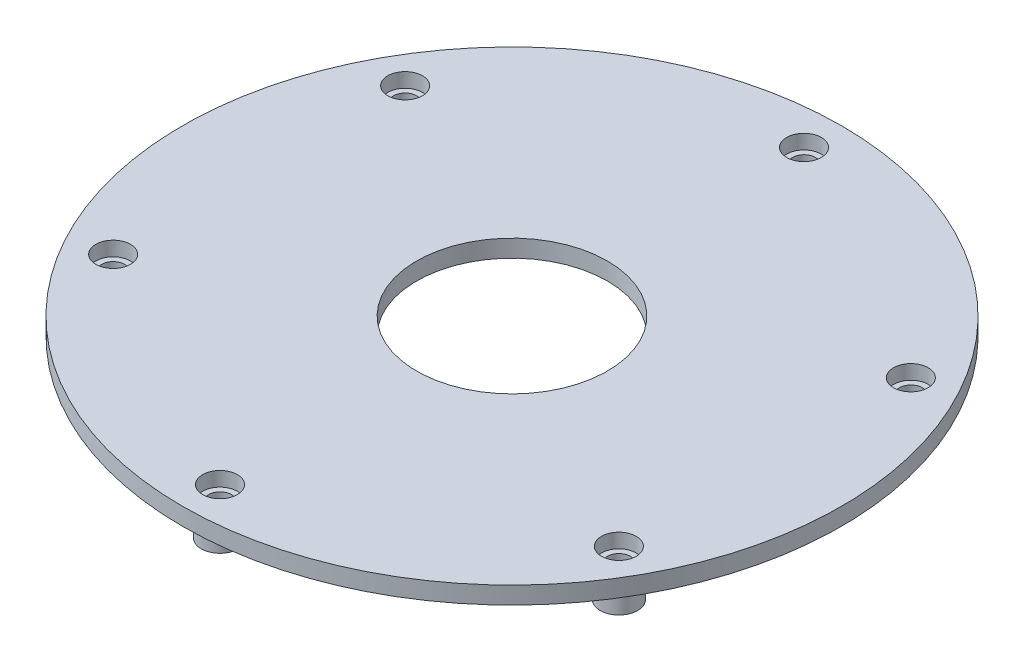
ISO-10303-21;
HEADER;
FILE_DESCRIPTION(('STEP AP214'),'2;1');
FILE_NAME('part.step','',(''),(''),'','','');
FILE_SCHEMA(('AUTOMOTIVE_DESIGN { 1 0 10303 214 1 1 1 1 }'));
ENDSEC;
DATA;
#1=APPLICATION_CONTEXT('core data for automotive mechanical design processes');
#2=APPLICATION_PROTOCOL_DEFINITION('international standard','automotive_design',2000,#1);
#3=PRODUCT_CONTEXT('',#1,'mechanical');
#4=PRODUCT('Part','Part','',(#3));
#5=PRODUCT_RELATED_PRODUCT_CATEGORY('part','',(#4));
#6=PRODUCT_DEFINITION_FORMATION('','',#4);
#7=PRODUCT_DEFINITION_CONTEXT('part definition',#1,'design');
#8=PRODUCT_DEFINITION('design','',#6,#7);
#9=PRODUCT_DEFINITION_SHAPE('','',#8);
#10=(LENGTH_UNIT() NAMED_UNIT(*) SI_UNIT(.MILLI.,.METRE.));
#11=(NAMED_UNIT(*) PLANE_ANGLE_UNIT() SI_UNIT($,.RADIAN.));
#12=(NAMED_UNIT(*) SI_UNIT($,.STERADIAN.) SOLID_ANGLE_UNIT());
#13=UNCERTAINTY_MEASURE_WITH_UNIT(LENGTH_MEASURE(1.E-05),#10,'distance_accuracy_value','');
#14=(GEOMETRIC_REPRESENTATION_CONTEXT(3) GLOBAL_UNCERTAINTY_ASSIGNED_CONTEXT((#13)) GLOBAL_UNIT_ASSIGNED_CONTEXT((#10,
#11,#12)) REPRESENTATION_CONTEXT('',''));
#15=CARTESIAN_POINT('',(0.,0.,0.));
#16=DIRECTION('',(0.,0.,1.));
#17=DIRECTION('',(1.,0.,0.));
#18=AXIS2_PLACEMENT_3D('',#15,#16,#17);
#19=CARTESIAN_POINT('',(0.,0.,-50.5));
#20=DIRECTION('',(0.,1.,0.));
#21=DIRECTION('',(0.,0.,1.));
#22=AXIS2_PLACEMENT_3D('',#19,#20,#21);
#23=CYLINDRICAL_SURFACE('',#22,2.);
#24=CARTESIAN_POINT('',(0.,-5.,-50.5));
#25=DIRECTION('',(0.,1.,0.));
#26=DIRECTION('',(0.,0.,1.));
#27=AXIS2_PLACEMENT_3D('',#24,#25,#26);
#28=CIRCLE('',#27,2.);
#29=CARTESIAN_POINT('',(0.,-5.,-48.5));
#30=VERTEX_POINT('',#29);
#31=EDGE_CURVE('E84',#30,#30,#28,.T.);
#32=ORIENTED_EDGE('',*,*,#31,.F.);
#33=EDGE_LOOP('',(#32));
#34=FACE_BOUND('',#33,.T.);
#35=CARTESIAN_POINT('',(0.,0.5,-50.5));
#36=DIRECTION('',(0.,1.,0.));
#37=DIRECTION('',(0.,0.,1.));
#38=AXIS2_PLACEMENT_3D('',#35,#36,#37);
#39=CIRCLE('',#38,2.);
#40=CARTESIAN_POINT('',(0.,0.5,-48.5));
#41=VERTEX_POINT('',#40);
#42=EDGE_CURVE('E41',#41,#41,#39,.F.);
#43=ORIENTED_EDGE('',*,*,#42,.F.);
#44=EDGE_LOOP('',(#43));
#45=FACE_BOUND('',#44,.T.);
#46=ADVANCED_FACE('F37',(#34,#45),#23,.F.);
#47=CARTESIAN_POINT('',(-43.7342828911142,0.,-25.2499999999999));
#48=DIRECTION('',(0.,1.,0.));
#49=DIRECTION('',(0.,0.,1.));
#50=AXIS2_PLACEMENT_3D('',#47,#48,#49);
#51=CYLINDRICAL_SURFACE('',#50,2.);
#52=CARTESIAN_POINT('',(-43.7342828911142,-5.,-25.2499999999999));
#53=DIRECTION('',(0.,1.,0.));
#54=DIRECTION('',(0.,0.,1.));
#55=AXIS2_PLACEMENT_3D('',#52,#53,#54);
#56=CIRCLE('',#55,2.);
#57=CARTESIAN_POINT('',(-43.7342828911142,-5.,-23.2499999999999));
#58=VERTEX_POINT('',#57);
#59=EDGE_CURVE('E79',#58,#58,#56,.T.);
#60=ORIENTED_EDGE('',*,*,#59,.F.);
#61=EDGE_LOOP('',(#60));
#62=FACE_BOUND('',#61,.T.);
#63=CARTESIAN_POINT('',(-43.7342828911142,0.5,-25.2499999999999));
#64=DIRECTION('',(0.,1.,0.));
#65=DIRECTION('',(0.,0.,1.));
#66=AXIS2_PLACEMENT_3D('',#63,#64,#65);
#67=CIRCLE('',#66,2.);
#68=CARTESIAN_POINT('',(-43.7342828911142,0.5,-23.2499999999999));
#69=VERTEX_POINT('',#68);
#70=EDGE_CURVE('E72',#69,#69,#67,.F.);
#71=ORIENTED_EDGE('',*,*,#70,.F.);
#72=EDGE_LOOP('',(#71));
#73=FACE_BOUND('',#72,.T.);
#74=ADVANCED_FACE('F184',(#62,#73),#51,.F.);
#75=CARTESIAN_POINT('',(-43.734282891114,0.,25.2500000000002));
#76=DIRECTION('',(0.,1.,0.));
#77=DIRECTION('',(0.,0.,1.));
#78=AXIS2_PLACEMENT_3D('',#75,#76,#77);
#79=CYLINDRICAL_SURFACE('',#78,2.);
#80=CARTESIAN_POINT('',(-43.734282891114,-5.,25.2500000000002));
#81=DIRECTION('',(0.,1.,0.));
#82=DIRECTION('',(0.,0.,1.));
#83=AXIS2_PLACEMENT_3D('',#80,#81,#82);
#84=CIRCLE('',#83,2.);
#85=CARTESIAN_POINT('',(-43.734282891114,-5.,27.2500000000002));
#86=VERTEX_POINT('',#85);
#87=EDGE_CURVE('E94',#86,#86,#84,.T.);
#88=ORIENTED_EDGE('',*,*,#87,.F.);
#89=EDGE_LOOP('',(#88));
#90=FACE_BOUND('',#89,.T.);
#91=CARTESIAN_POINT('',(-43.734282891114,0.5,25.2500000000002));
#92=DIRECTION('',(0.,1.,0.));
#93=DIRECTION('',(0.,0.,1.));
#94=AXIS2_PLACEMENT_3D('',#91,#92,#93);
#95=CIRCLE('',#94,2.);
#96=CARTESIAN_POINT('',(-43.734282891114,0.5,27.2500000000002));
#97=VERTEX_POINT('',#96);
#98=EDGE_CURVE('E69',#97,#97,#95,.F.);
#99=ORIENTED_EDGE('',*,*,#98,.F.);
#100=EDGE_LOOP('',(#99));
#101=FACE_BOUND('',#100,.T.);
#102=ADVANCED_FACE('F190',(#90,#101),#79,.F.);
#103=CARTESIAN_POINT('',(0.,0.,50.5));
#104=DIRECTION('',(0.,1.,0.));
#105=DIRECTION('',(0.,0.,1.));
#106=AXIS2_PLACEMENT_3D('',#103,#104,#105);
#107=CYLINDRICAL_SURFACE('',#106,2.);
#108=CARTESIAN_POINT('',(0.,-5.,50.5));
#109=DIRECTION('',(0.,1.,0.));
#110=DIRECTION('',(0.,0.,1.));
#111=AXIS2_PLACEMENT_3D('',#108,#109,#110);
#112=CIRCLE('',#111,2.);
#113=CARTESIAN_POINT('',(0.,-5.,52.5));
#114=VERTEX_POINT('',#113);
#115=EDGE_CURVE('E99',#114,#114,#112,.T.);
#116=ORIENTED_EDGE('',*,*,#115,.F.);
#117=EDGE_LOOP('',(#116));
#118=FACE_BOUND('',#117,.T.);
#119=CARTESIAN_POINT('',(0.,0.5,50.5));
#120=DIRECTION('',(0.,1.,0.));
#121=DIRECTION('',(0.,0.,1.));
#122=AXIS2_PLACEMENT_3D('',#119,#120,#121);
#123=CIRCLE('',#122,2.);
#124=CARTESIAN_POINT('',(0.,0.5,52.5));
#125=VERTEX_POINT('',#124);
#126=EDGE_CURVE('E65',#125,#125,#123,.F.);
#127=ORIENTED_EDGE('',*,*,#126,.F.);
#128=EDGE_LOOP('',(#127));
#129=FACE_BOUND('',#128,.T.);
#130=ADVANCED_FACE('F198',(#118,#129),#107,.F.);
#131=CARTESIAN_POINT('',(43.7342828911144,0.,25.2499999999996));
#132=DIRECTION('',(0.,1.,0.));
#133=DIRECTION('',(0.,0.,1.));
#134=AXIS2_PLACEMENT_3D('',#131,#132,#133);
#135=CYLINDRICAL_SURFACE('',#134,2.);
#136=CARTESIAN_POINT('',(43.7342828911144,-5.,25.2499999999996));
#137=DIRECTION('',(0.,1.,0.));
#138=DIRECTION('',(0.,0.,1.));
#139=AXIS2_PLACEMENT_3D('',#136,#137,#138);
#140=CIRCLE('',#139,2.);
#141=CARTESIAN_POINT('',(43.7342828911144,-5.,27.2499999999996));
#142=VERTEX_POINT('',#141);
#143=EDGE_CURVE('E356',#142,#142,#140,.T.);
#144=ORIENTED_EDGE('',*,*,#143,.F.);
#145=EDGE_LOOP('',(#144));
#146=FACE_BOUND('',#145,.T.);
#147=CARTESIAN_POINT('',(43.7342828911144,0.5,25.2499999999996));
#148=DIRECTION('',(0.,1.,0.));
#149=DIRECTION('',(0.,0.,1.));
#150=AXIS2_PLACEMENT_3D('',#147,#148,#149);
#151=CIRCLE('',#150,2.);
#152=CARTESIAN_POINT('',(43.7342828911144,0.5,27.2499999999996));
#153=VERTEX_POINT('',#152);
#154=EDGE_CURVE('E60',#153,#153,#151,.F.);
#155=ORIENTED_EDGE('',*,*,#154,.F.);
#156=EDGE_LOOP('',(#155));
#157=FACE_BOUND('',#156,.T.);
#158=ADVANCED_FACE('F179',(#146,#157),#135,.F.);
#159=CARTESIAN_POINT('',(43.7342828911139,0.,-25.2500000000005));
#160=DIRECTION('',(0.,1.,0.));
#161=DIRECTION('',(0.,0.,1.));
#162=AXIS2_PLACEMENT_3D('',#159,#160,#161);
#163=CYLINDRICAL_SURFACE('',#162,2.);
#164=CARTESIAN_POINT('',(43.7342828911139,-5.,-25.2500000000005));
#165=DIRECTION('',(0.,1.,0.));
#166=DIRECTION('',(0.,0.,1.));
#167=AXIS2_PLACEMENT_3D('',#164,#165,#166);
#168=CIRCLE('',#167,2.);
#169=CARTESIAN_POINT('',(43.7342828911139,-5.,-23.2500000000005));
#170=VERTEX_POINT('',#169);
#171=EDGE_CURVE('E90',#170,#170,#168,.T.);
#172=ORIENTED_EDGE('',*,*,#171,.F.);
#173=EDGE_LOOP('',(#172));
#174=FACE_BOUND('',#173,.T.);
#175=CARTESIAN_POINT('',(43.7342828911139,0.5,-25.2500000000005));
#176=DIRECTION('',(0.,1.,0.));
#177=DIRECTION('',(0.,0.,1.));
#178=AXIS2_PLACEMENT_3D('',#175,#176,#177);
#179=CIRCLE('',#178,2.);
#180=CARTESIAN_POINT('',(43.7342828911139,0.5,-23.2500000000005));
#181=VERTEX_POINT('',#180);
#182=EDGE_CURVE('E56',#181,#181,#179,.F.);
#183=ORIENTED_EDGE('',*,*,#182,.F.);
#184=EDGE_LOOP('',(#183));
#185=FACE_BOUND('',#184,.T.);
#186=ADVANCED_FACE('F171',(#174,#185),#163,.F.);
#187=CARTESIAN_POINT('',(0.,3.,0.));
#188=DIRECTION('',(0.,-1.,0.));
#189=DIRECTION('',(0.,0.,-1.));
#190=AXIS2_PLACEMENT_3D('',#187,#188,#189);
#191=CYLINDRICAL_SURFACE('',#190,57.);
#192=CARTESIAN_POINT('',(0.,3.,0.));
#193=DIRECTION('',(0.,1.,0.));
#194=DIRECTION('',(0.,0.,1.));
#195=AXIS2_PLACEMENT_3D('',#192,#193,#194);
#196=CIRCLE('',#195,57.);
#197=CARTESIAN_POINT('',(0.,3.,57.));
#198=VERTEX_POINT('',#197);
#199=EDGE_CURVE('E132',#198,#198,#196,.T.);
#200=ORIENTED_EDGE('',*,*,#199,.F.);
#201=EDGE_LOOP('',(#200));
#202=FACE_BOUND('',#201,.T.);
#203=CARTESIAN_POINT('',(0.,0.,0.));
#204=DIRECTION('',(0.,1.,0.));
#205=DIRECTION('',(0.,0.,1.));
#206=AXIS2_PLACEMENT_3D('',#203,#204,#205);
#207=CIRCLE('',#206,57.);
#208=CARTESIAN_POINT('',(0.,0.,57.));
#209=VERTEX_POINT('',#208);
#210=EDGE_CURVE('E131',#209,#209,#207,.T.);
#211=ORIENTED_EDGE('',*,*,#210,.T.);
#212=EDGE_LOOP('',(#211));
#213=FACE_BOUND('',#212,.T.);
#214=ADVANCED_FACE('F39',(#202,#213),#191,.T.);
#215=CARTESIAN_POINT('',(0.,3.,0.));
#216=DIRECTION('',(0.,1.,0.));
#217=DIRECTION('',(0.,0.,1.));
#218=AXIS2_PLACEMENT_3D('',#215,#216,#217);
#219=PLANE('',#218);
#220=CARTESIAN_POINT('',(-43.734282891114,3.,25.2500000000002));
#221=DIRECTION('',(0.,1.,0.));
#222=DIRECTION('',(0.,0.,1.));
#223=AXIS2_PLACEMENT_3D('',#220,#221,#222);
#224=CIRCLE('',#223,3.);
#225=CARTESIAN_POINT('',(-43.734282891114,3.,28.2500000000002));
#226=VERTEX_POINT('',#225);
#227=EDGE_CURVE('E346',#226,#226,#224,.T.);
#228=ORIENTED_EDGE('',*,*,#227,.F.);
#229=EDGE_LOOP('',(#228));
#230=FACE_BOUND('',#229,.T.);
#231=CARTESIAN_POINT('',(0.,3.,50.5));
#232=DIRECTION('',(0.,1.,0.));
#233=DIRECTION('',(0.,0.,1.));
#234=AXIS2_PLACEMENT_3D('',#231,#232,#233);
#235=CIRCLE('',#234,3.);
#236=CARTESIAN_POINT('',(0.,3.,53.5));
#237=VERTEX_POINT('',#236);
#238=EDGE_CURVE('E338',#237,#237,#235,.T.);
#239=ORIENTED_EDGE('',*,*,#238,.F.);
#240=EDGE_LOOP('',(#239));
#241=FACE_BOUND('',#240,.T.);
#242=CARTESIAN_POINT('',(43.7342828911144,3.,25.2499999999996));
#243=DIRECTION('',(0.,1.,0.));
#244=DIRECTION('',(0.,0.,1.));
#245=AXIS2_PLACEMENT_3D('',#242,#243,#244);
#246=CIRCLE('',#245,3.);
#247=CARTESIAN_POINT('',(43.7342828911144,3.,28.2499999999996));
#248=VERTEX_POINT('',#247);
#249=EDGE_CURVE('E330',#248,#248,#246,.T.);
#250=ORIENTED_EDGE('',*,*,#249,.F.);
#251=EDGE_LOOP('',(#250));
#252=FACE_BOUND('',#251,.T.);
#253=CARTESIAN_POINT('',(43.7342828911139,3.,-25.2500000000005));
#254=DIRECTION('',(0.,1.,0.));
#255=DIRECTION('',(0.,0.,1.));
#256=AXIS2_PLACEMENT_3D('',#253,#254,#255);
#257=CIRCLE('',#256,3.);
#258=CARTESIAN_POINT('',(43.7342828911139,3.,-22.2500000000005));
#259=VERTEX_POINT('',#258);
#260=EDGE_CURVE('E322',#259,#259,#257,.T.);
#261=ORIENTED_EDGE('',*,*,#260,.F.);
#262=EDGE_LOOP('',(#261));
#263=FACE_BOUND('',#262,.T.);
#264=CARTESIAN_POINT('',(0.,3.,-50.5));
#265=DIRECTION('',(0.,1.,0.));
#266=DIRECTION('',(0.,0.,1.));
#267=AXIS2_PLACEMENT_3D('',#264,#265,#266);
#268=CIRCLE('',#267,3.);
#269=CARTESIAN_POINT('',(0.,3.,-47.5));
#270=VERTEX_POINT('',#269);
#271=EDGE_CURVE('E309',#270,#270,#268,.T.);
#272=ORIENTED_EDGE('',*,*,#271,.F.);
#273=EDGE_LOOP('',(#272));
#274=FACE_BOUND('',#273,.T.);
#275=CARTESIAN_POINT('',(-43.7342828911142,3.,-25.2499999999999));
#276=DIRECTION('',(0.,1.,0.));
#277=DIRECTION('',(0.,0.,1.));
#278=AXIS2_PLACEMENT_3D('',#275,#276,#277);
#279=CIRCLE('',#278,3.);
#280=CARTESIAN_POINT('',(-43.7342828911142,3.,-22.2499999999999));
#281=VERTEX_POINT('',#280);
#282=EDGE_CURVE('E308',#281,#281,#279,.T.);
#283=ORIENTED_EDGE('',*,*,#282,.F.);
#284=EDGE_LOOP('',(#283));
#285=FACE_BOUND('',#284,.T.);
#286=CARTESIAN_POINT('',(0.,3.,0.));
#287=DIRECTION('',(0.,-1.,0.));
#288=DIRECTION('',(0.,0.,-1.));
#289=AXIS2_PLACEMENT_3D('',#286,#287,#288);
#290=CIRCLE('',#289,16.5);
#291=CARTESIAN_POINT('',(0.,3.,-16.5));
#292=VERTEX_POINT('',#291);
#293=EDGE_CURVE('E100',#292,#292,#290,.T.);
#294=ORIENTED_EDGE('',*,*,#293,.T.);
#295=EDGE_LOOP('',(#294));
#296=FACE_BOUND('',#295,.T.);
#297=ORIENTED_EDGE('',*,*,#199,.T.);
#298=EDGE_LOOP('',(#297));
#299=FACE_BOUND('',#298,.T.);
#300=ADVANCED_FACE('F160',(#230,#241,#252,#263,#274,#285,#296,#299),#219,.T.);
#301=CARTESIAN_POINT('',(0.,0.,0.));
#302=DIRECTION('',(0.,1.,0.));
#303=DIRECTION('',(0.,0.,1.));
#304=AXIS2_PLACEMENT_3D('',#301,#302,#303);
#305=PLANE('',#304);
#306=CARTESIAN_POINT('',(0.,0.,0.));
#307=DIRECTION('',(0.,-1.,0.));
#308=DIRECTION('',(0.,0.,-1.));
#309=AXIS2_PLACEMENT_3D('',#306,#307,#308);
#310=CIRCLE('',#309,16.5);
#311=CARTESIAN_POINT('',(0.,0.,-16.5));
#312=VERTEX_POINT('',#311);
#313=EDGE_CURVE('E98',#312,#312,#310,.T.);
#314=ORIENTED_EDGE('',*,*,#313,.F.);
#315=EDGE_LOOP('',(#314));
#316=FACE_BOUND('',#315,.T.);
#317=CARTESIAN_POINT('',(-43.734282891114,0.,25.2500000000002));
#318=DIRECTION('',(0.,1.,0.));
#319=DIRECTION('',(0.,0.,1.));
#320=AXIS2_PLACEMENT_3D('',#317,#318,#319);
#321=CIRCLE('',#320,3.25);
#322=CARTESIAN_POINT('',(-43.734282891114,0.,28.5000000000002));
#323=VERTEX_POINT('',#322);
#324=EDGE_CURVE('E10',#323,#323,#321,.F.);
#325=ORIENTED_EDGE('',*,*,#324,.F.);
#326=EDGE_LOOP('',(#325));
#327=FACE_BOUND('',#326,.T.);
#328=CARTESIAN_POINT('',(-43.7342828911142,0.,-25.2499999999999));
#329=DIRECTION('',(0.,1.,0.));
#330=DIRECTION('',(0.,0.,1.));
#331=AXIS2_PLACEMENT_3D('',#328,#329,#330);
#332=CIRCLE('',#331,3.25);
#333=CARTESIAN_POINT('',(-43.7342828911142,0.,-21.9999999999999));
#334=VERTEX_POINT('',#333);
#335=EDGE_CURVE('E46',#334,#334,#332,.F.);
#336=ORIENTED_EDGE('',*,*,#335,.F.);
#337=EDGE_LOOP('',(#336));
#338=FACE_BOUND('',#337,.T.);
#339=CARTESIAN_POINT('',(0.,0.,-50.5));
#340=DIRECTION('',(0.,1.,0.));
#341=DIRECTION('',(0.,0.,1.));
#342=AXIS2_PLACEMENT_3D('',#339,#340,#341);
#343=CIRCLE('',#342,3.25);
#344=CARTESIAN_POINT('',(0.,0.,-47.25));
#345=VERTEX_POINT('',#344);
#346=EDGE_CURVE('E52',#345,#345,#343,.F.);
#347=ORIENTED_EDGE('',*,*,#346,.F.);
#348=EDGE_LOOP('',(#347));
#349=FACE_BOUND('',#348,.T.);
#350=CARTESIAN_POINT('',(43.7342828911139,0.,-25.2500000000005));
#351=DIRECTION('',(0.,1.,0.));
#352=DIRECTION('',(0.,0.,1.));
#353=AXIS2_PLACEMENT_3D('',#350,#351,#352);
#354=CIRCLE('',#353,3.25);
#355=CARTESIAN_POINT('',(43.7342828911139,0.,-22.0000000000005));
#356=VERTEX_POINT('',#355);
#357=EDGE_CURVE('E147',#356,#356,#354,.F.);
#358=ORIENTED_EDGE('',*,*,#357,.F.);
#359=EDGE_LOOP('',(#358));
#360=FACE_BOUND('',#359,.T.);
#361=CARTESIAN_POINT('',(43.7342828911144,0.,25.2499999999996));
#362=DIRECTION('',(0.,1.,0.));
#363=DIRECTION('',(0.,0.,1.));
#364=AXIS2_PLACEMENT_3D('',#361,#362,#363);
#365=CIRCLE('',#364,3.25);
#366=CARTESIAN_POINT('',(43.7342828911144,0.,28.4999999999996));
#367=VERTEX_POINT('',#366);
#368=EDGE_CURVE('E143',#367,#367,#365,.F.);
#369=ORIENTED_EDGE('',*,*,#368,.F.);
#370=EDGE_LOOP('',(#369));
#371=FACE_BOUND('',#370,.T.);
#372=CARTESIAN_POINT('',(0.,0.,50.5));
#373=DIRECTION('',(0.,1.,0.));
#374=DIRECTION('',(0.,0.,1.));
#375=AXIS2_PLACEMENT_3D('',#372,#373,#374);
#376=CIRCLE('',#375,3.25);
#377=CARTESIAN_POINT('',(0.,0.,53.75));
#378=VERTEX_POINT('',#377);
#379=EDGE_CURVE('E136',#378,#378,#376,.F.);
#380=ORIENTED_EDGE('',*,*,#379,.F.);
#381=EDGE_LOOP('',(#380));
#382=FACE_BOUND('',#381,.T.);
#383=ORIENTED_EDGE('',*,*,#210,.F.);
#384=EDGE_LOOP('',(#383));
#385=FACE_BOUND('',#384,.T.);
#386=ADVANCED_FACE('F156',(#316,#327,#338,#349,#360,#371,#382,#385),#305,.F.);
#387=CARTESIAN_POINT('',(0.,-5.,50.5));
#388=DIRECTION('',(0.,1.,0.));
#389=DIRECTION('',(0.,0.,1.));
#390=AXIS2_PLACEMENT_3D('',#387,#388,#389);
#391=CYLINDRICAL_SURFACE('',#390,3.25);
#392=CARTESIAN_POINT('',(0.,-5.,50.5));
#393=DIRECTION('',(0.,-1.,0.));
#394=DIRECTION('',(0.,0.,-1.));
#395=AXIS2_PLACEMENT_3D('',#392,#393,#394);
#396=CIRCLE('',#395,3.25);
#397=CARTESIAN_POINT('',(0.,-5.,47.25));
#398=VERTEX_POINT('',#397);
#399=EDGE_CURVE('E127',#398,#398,#396,.T.);
#400=ORIENTED_EDGE('',*,*,#399,.F.);
#401=EDGE_LOOP('',(#400));
#402=FACE_BOUND('',#401,.T.);
#403=ORIENTED_EDGE('',*,*,#379,.T.);
#404=EDGE_LOOP('',(#403));
#405=FACE_BOUND('',#404,.T.);
#406=ADVANCED_FACE('F159',(#402,#405),#391,.T.);
#407=CARTESIAN_POINT('',(0.,-5.,50.5));
#408=DIRECTION('',(0.,-1.,0.));
#409=DIRECTION('',(0.,0.,-1.));
#410=AXIS2_PLACEMENT_3D('',#407,#408,#409);
#411=PLANE('',#410);
#412=ORIENTED_EDGE('',*,*,#115,.T.);
#413=EDGE_LOOP('',(#412));
#414=FACE_BOUND('',#413,.T.);
#415=ORIENTED_EDGE('',*,*,#399,.T.);
#416=EDGE_LOOP('',(#415));
#417=FACE_BOUND('',#416,.T.);
#418=ADVANCED_FACE('F208',(#414,#417),#411,.T.);
#419=CARTESIAN_POINT('',(43.7342828911144,-5.,25.2499999999996));
#420=DIRECTION('',(0.,1.,0.));
#421=DIRECTION('',(0.,0.,1.));
#422=AXIS2_PLACEMENT_3D('',#419,#420,#421);
#423=CYLINDRICAL_SURFACE('',#422,3.25);
#424=CARTESIAN_POINT('',(43.7342828911144,-5.,25.2499999999996));
#425=DIRECTION('',(0.,-1.,0.));
#426=DIRECTION('',(0.,0.,-1.));
#427=AXIS2_PLACEMENT_3D('',#424,#425,#426);
#428=CIRCLE('',#427,3.25);
#429=CARTESIAN_POINT('',(43.7342828911144,-5.,21.9999999999996));
#430=VERTEX_POINT('',#429);
#431=EDGE_CURVE('E123',#430,#430,#428,.T.);
#432=ORIENTED_EDGE('',*,*,#431,.F.);
#433=EDGE_LOOP('',(#432));
#434=FACE_BOUND('',#433,.T.);
#435=ORIENTED_EDGE('',*,*,#368,.T.);
#436=EDGE_LOOP('',(#435));
#437=FACE_BOUND('',#436,.T.);
#438=ADVANCED_FACE('F212',(#434,#437),#423,.T.);
#439=CARTESIAN_POINT('',(43.7342828911144,-5.,25.2499999999996));
#440=DIRECTION('',(0.,-1.,0.));
#441=DIRECTION('',(0.,0.,-1.));
#442=AXIS2_PLACEMENT_3D('',#439,#440,#441);
#443=PLANE('',#442);
#444=ORIENTED_EDGE('',*,*,#143,.T.);
#445=EDGE_LOOP('',(#444));
#446=FACE_BOUND('',#445,.T.);
#447=ORIENTED_EDGE('',*,*,#431,.T.);
#448=EDGE_LOOP('',(#447));
#449=FACE_BOUND('',#448,.T.);
#450=ADVANCED_FACE('F216',(#446,#449),#443,.T.);
#451=CARTESIAN_POINT('',(43.7342828911139,-5.,-25.2500000000005));
#452=DIRECTION('',(0.,1.,0.));
#453=DIRECTION('',(0.,0.,1.));
#454=AXIS2_PLACEMENT_3D('',#451,#452,#453);
#455=CYLINDRICAL_SURFACE('',#454,3.25);
#456=CARTESIAN_POINT('',(43.7342828911139,-5.,-25.2500000000005));
#457=DIRECTION('',(0.,-1.,0.));
#458=DIRECTION('',(0.,0.,-1.));
#459=AXIS2_PLACEMENT_3D('',#456,#457,#458);
#460=CIRCLE('',#459,3.25);
#461=CARTESIAN_POINT('',(43.7342828911139,-5.,-28.5000000000005));
#462=VERTEX_POINT('',#461);
#463=EDGE_CURVE('E119',#462,#462,#460,.T.);
#464=ORIENTED_EDGE('',*,*,#463,.F.);
#465=EDGE_LOOP('',(#464));
#466=FACE_BOUND('',#465,.T.);
#467=ORIENTED_EDGE('',*,*,#357,.T.);
#468=EDGE_LOOP('',(#467));
#469=FACE_BOUND('',#468,.T.);
#470=ADVANCED_FACE('F220',(#466,#469),#455,.T.);
#471=CARTESIAN_POINT('',(43.7342828911139,-5.,-25.2500000000005));
#472=DIRECTION('',(0.,-1.,0.));
#473=DIRECTION('',(0.,0.,-1.));
#474=AXIS2_PLACEMENT_3D('',#471,#472,#473);
#475=PLANE('',#474);
#476=ORIENTED_EDGE('',*,*,#171,.T.);
#477=EDGE_LOOP('',(#476));
#478=FACE_BOUND('',#477,.T.);
#479=ORIENTED_EDGE('',*,*,#463,.T.);
#480=EDGE_LOOP('',(#479));
#481=FACE_BOUND('',#480,.T.);
#482=ADVANCED_FACE('F224',(#478,#481),#475,.T.);
#483=CARTESIAN_POINT('',(0.,-5.,-50.5));
#484=DIRECTION('',(0.,1.,0.));
#485=DIRECTION('',(0.,0.,1.));
#486=AXIS2_PLACEMENT_3D('',#483,#484,#485);
#487=CYLINDRICAL_SURFACE('',#486,3.25);
#488=CARTESIAN_POINT('',(0.,-5.,-50.5));
#489=DIRECTION('',(0.,-1.,0.));
#490=DIRECTION('',(0.,0.,-1.));
#491=AXIS2_PLACEMENT_3D('',#488,#489,#490);
#492=CIRCLE('',#491,3.25);
#493=CARTESIAN_POINT('',(0.,-5.,-53.75));
#494=VERTEX_POINT('',#493);
#495=EDGE_CURVE('E115',#494,#494,#492,.T.);
#496=ORIENTED_EDGE('',*,*,#495,.F.);
#497=EDGE_LOOP('',(#496));
#498=FACE_BOUND('',#497,.T.);
#499=ORIENTED_EDGE('',*,*,#346,.T.);
#500=EDGE_LOOP('',(#499));
#501=FACE_BOUND('',#500,.T.);
#502=ADVANCED_FACE('F154',(#498,#501),#487,.T.);
#503=CARTESIAN_POINT('',(0.,-5.,-50.5));
#504=DIRECTION('',(0.,-1.,0.));
#505=DIRECTION('',(0.,0.,-1.));
#506=AXIS2_PLACEMENT_3D('',#503,#504,#505);
#507=PLANE('',#506);
#508=ORIENTED_EDGE('',*,*,#31,.T.);
#509=EDGE_LOOP('',(#508));
#510=FACE_BOUND('',#509,.T.);
#511=ORIENTED_EDGE('',*,*,#495,.T.);
#512=EDGE_LOOP('',(#511));
#513=FACE_BOUND('',#512,.T.);
#514=ADVANCED_FACE('F231',(#510,#513),#507,.T.);
#515=CARTESIAN_POINT('',(-43.7342828911142,-5.,-25.2499999999999));
#516=DIRECTION('',(0.,1.,0.));
#517=DIRECTION('',(0.,0.,1.));
#518=AXIS2_PLACEMENT_3D('',#515,#516,#517);
#519=CYLINDRICAL_SURFACE('',#518,3.25);
#520=CARTESIAN_POINT('',(-43.7342828911142,-5.,-25.2499999999999));
#521=DIRECTION('',(0.,-1.,0.));
#522=DIRECTION('',(0.,0.,-1.));
#523=AXIS2_PLACEMENT_3D('',#520,#521,#522);
#524=CIRCLE('',#523,3.25);
#525=CARTESIAN_POINT('',(-43.7342828911142,-5.,-28.4999999999999));
#526=VERTEX_POINT('',#525);
#527=EDGE_CURVE('E111',#526,#526,#524,.T.);
#528=ORIENTED_EDGE('',*,*,#527,.F.);
#529=EDGE_LOOP('',(#528));
#530=FACE_BOUND('',#529,.T.);
#531=ORIENTED_EDGE('',*,*,#335,.T.);
#532=EDGE_LOOP('',(#531));
#533=FACE_BOUND('',#532,.T.);
#534=ADVANCED_FACE('F235',(#530,#533),#519,.T.);
#535=CARTESIAN_POINT('',(-43.7342828911142,-5.,-25.2499999999999));
#536=DIRECTION('',(0.,-1.,0.));
#537=DIRECTION('',(0.,0.,-1.));
#538=AXIS2_PLACEMENT_3D('',#535,#536,#537);
#539=PLANE('',#538);
#540=ORIENTED_EDGE('',*,*,#59,.T.);
#541=EDGE_LOOP('',(#540));
#542=FACE_BOUND('',#541,.T.);
#543=ORIENTED_EDGE('',*,*,#527,.T.);
#544=EDGE_LOOP('',(#543));
#545=FACE_BOUND('',#544,.T.);
#546=ADVANCED_FACE('F239',(#542,#545),#539,.T.);
#547=CARTESIAN_POINT('',(-43.734282891114,-5.,25.2500000000002));
#548=DIRECTION('',(0.,1.,0.));
#549=DIRECTION('',(0.,0.,1.));
#550=AXIS2_PLACEMENT_3D('',#547,#548,#549);
#551=CYLINDRICAL_SURFACE('',#550,3.25);
#552=CARTESIAN_POINT('',(-43.734282891114,-5.,25.2500000000002));
#553=DIRECTION('',(0.,-1.,0.));
#554=DIRECTION('',(0.,0.,-1.));
#555=AXIS2_PLACEMENT_3D('',#552,#553,#554);
#556=CIRCLE('',#555,3.25);
#557=CARTESIAN_POINT('',(-43.734282891114,-5.,22.0000000000002));
#558=VERTEX_POINT('',#557);
#559=EDGE_CURVE('E104',#558,#558,#556,.T.);
#560=ORIENTED_EDGE('',*,*,#559,.F.);
#561=EDGE_LOOP('',(#560));
#562=FACE_BOUND('',#561,.T.);
#563=ORIENTED_EDGE('',*,*,#324,.T.);
#564=EDGE_LOOP('',(#563));
#565=FACE_BOUND('',#564,.T.);
#566=ADVANCED_FACE('F243',(#562,#565),#551,.T.);
#567=CARTESIAN_POINT('',(-43.734282891114,-5.,25.2500000000002));
#568=DIRECTION('',(0.,-1.,0.));
#569=DIRECTION('',(0.,0.,-1.));
#570=AXIS2_PLACEMENT_3D('',#567,#568,#569);
#571=PLANE('',#570);
#572=ORIENTED_EDGE('',*,*,#87,.T.);
#573=EDGE_LOOP('',(#572));
#574=FACE_BOUND('',#573,.T.);
#575=ORIENTED_EDGE('',*,*,#559,.T.);
#576=EDGE_LOOP('',(#575));
#577=FACE_BOUND('',#576,.T.);
#578=ADVANCED_FACE('F246',(#574,#577),#571,.T.);
#579=CARTESIAN_POINT('',(0.,3.,0.));
#580=DIRECTION('',(0.,-1.,0.));
#581=DIRECTION('',(0.,0.,-1.));
#582=AXIS2_PLACEMENT_3D('',#579,#580,#581);
#583=CYLINDRICAL_SURFACE('',#582,16.5);
#584=ORIENTED_EDGE('',*,*,#293,.F.);
#585=EDGE_LOOP('',(#584));
#586=FACE_BOUND('',#585,.T.);
#587=ORIENTED_EDGE('',*,*,#313,.T.);
#588=EDGE_LOOP('',(#587));
#589=FACE_BOUND('',#588,.T.);
#590=ADVANCED_FACE('F250',(#586,#589),#583,.F.);
#591=CARTESIAN_POINT('',(43.7342828911139,0.5,-25.2500000000005));
#592=DIRECTION('',(0.,1.,0.));
#593=DIRECTION('',(0.,0.,1.));
#594=AXIS2_PLACEMENT_3D('',#591,#592,#593);
#595=PLANE('',#594);
#596=CARTESIAN_POINT('',(43.7342828911139,0.5,-25.2500000000005));
#597=DIRECTION('',(0.,1.,0.));
#598=DIRECTION('',(0.,0.,1.));
#599=AXIS2_PLACEMENT_3D('',#596,#597,#598);
#600=CIRCLE('',#599,3.);
#601=CARTESIAN_POINT('',(43.7342828911139,0.5,-22.2500000000005));
#602=VERTEX_POINT('',#601);
#603=EDGE_CURVE('E316',#602,#602,#600,.T.);
#604=ORIENTED_EDGE('',*,*,#603,.T.);
#605=EDGE_LOOP('',(#604));
#606=FACE_BOUND('',#605,.T.);
#607=ORIENTED_EDGE('',*,*,#182,.T.);
#608=EDGE_LOOP('',(#607));
#609=FACE_BOUND('',#608,.T.);
#610=ADVANCED_FACE('F254',(#606,#609),#595,.T.);
#611=CARTESIAN_POINT('',(43.7342828911139,0.5,-25.2500000000005));
#612=DIRECTION('',(0.,1.,0.));
#613=DIRECTION('',(0.,0.,1.));
#614=AXIS2_PLACEMENT_3D('',#611,#612,#613);
#615=CYLINDRICAL_SURFACE('',#614,3.);
#616=ORIENTED_EDGE('',*,*,#603,.F.);
#617=EDGE_LOOP('',(#616));
#618=FACE_BOUND('',#617,.T.);
#619=ORIENTED_EDGE('',*,*,#260,.T.);
#620=EDGE_LOOP('',(#619));
#621=FACE_BOUND('',#620,.T.);
#622=ADVANCED_FACE('F288',(#618,#621),#615,.F.);
#623=CARTESIAN_POINT('',(43.7342828911144,0.5,25.2499999999996));
#624=DIRECTION('',(0.,1.,0.));
#625=DIRECTION('',(0.,0.,1.));
#626=AXIS2_PLACEMENT_3D('',#623,#624,#625);
#627=PLANE('',#626);
#628=CARTESIAN_POINT('',(43.7342828911144,0.5,25.2499999999996));
#629=DIRECTION('',(0.,1.,0.));
#630=DIRECTION('',(0.,0.,1.));
#631=AXIS2_PLACEMENT_3D('',#628,#629,#630);
#632=CIRCLE('',#631,3.);
#633=CARTESIAN_POINT('',(43.7342828911144,0.5,28.2499999999996));
#634=VERTEX_POINT('',#633);
#635=EDGE_CURVE('E326',#634,#634,#632,.T.);
#636=ORIENTED_EDGE('',*,*,#635,.T.);
#637=EDGE_LOOP('',(#636));
#638=FACE_BOUND('',#637,.T.);
#639=ORIENTED_EDGE('',*,*,#154,.T.);
#640=EDGE_LOOP('',(#639));
#641=FACE_BOUND('',#640,.T.);
#642=ADVANCED_FACE('F284',(#638,#641),#627,.T.);
#643=CARTESIAN_POINT('',(43.7342828911144,0.5,25.2499999999996));
#644=DIRECTION('',(0.,1.,0.));
#645=DIRECTION('',(0.,0.,1.));
#646=AXIS2_PLACEMENT_3D('',#643,#644,#645);
#647=CYLINDRICAL_SURFACE('',#646,3.);
#648=ORIENTED_EDGE('',*,*,#635,.F.);
#649=EDGE_LOOP('',(#648));
#650=FACE_BOUND('',#649,.T.);
#651=ORIENTED_EDGE('',*,*,#249,.T.);
#652=EDGE_LOOP('',(#651));
#653=FACE_BOUND('',#652,.T.);
#654=ADVANCED_FACE('F280',(#650,#653),#647,.F.);
#655=CARTESIAN_POINT('',(0.,0.5,50.5));
#656=DIRECTION('',(0.,1.,0.));
#657=DIRECTION('',(0.,0.,1.));
#658=AXIS2_PLACEMENT_3D('',#655,#656,#657);
#659=PLANE('',#658);
#660=CARTESIAN_POINT('',(0.,0.5,50.5));
#661=DIRECTION('',(0.,1.,0.));
#662=DIRECTION('',(0.,0.,1.));
#663=AXIS2_PLACEMENT_3D('',#660,#661,#662);
#664=CIRCLE('',#663,3.);
#665=CARTESIAN_POINT('',(0.,0.5,53.5));
#666=VERTEX_POINT('',#665);
#667=EDGE_CURVE('E334',#666,#666,#664,.T.);
#668=ORIENTED_EDGE('',*,*,#667,.T.);
#669=EDGE_LOOP('',(#668));
#670=FACE_BOUND('',#669,.T.);
#671=ORIENTED_EDGE('',*,*,#126,.T.);
#672=EDGE_LOOP('',(#671));
#673=FACE_BOUND('',#672,.T.);
#674=ADVANCED_FACE('F276',(#670,#673),#659,.T.);
#675=CARTESIAN_POINT('',(0.,0.5,50.5));
#676=DIRECTION('',(0.,1.,0.));
#677=DIRECTION('',(0.,0.,1.));
#678=AXIS2_PLACEMENT_3D('',#675,#676,#677);
#679=CYLINDRICAL_SURFACE('',#678,3.);
#680=ORIENTED_EDGE('',*,*,#667,.F.);
#681=EDGE_LOOP('',(#680));
#682=FACE_BOUND('',#681,.T.);
#683=ORIENTED_EDGE('',*,*,#238,.T.);
#684=EDGE_LOOP('',(#683));
#685=FACE_BOUND('',#684,.T.);
#686=ADVANCED_FACE('F272',(#682,#685),#679,.F.);
#687=CARTESIAN_POINT('',(-43.734282891114,0.5,25.2500000000002));
#688=DIRECTION('',(0.,1.,0.));
#689=DIRECTION('',(0.,0.,1.));
#690=AXIS2_PLACEMENT_3D('',#687,#688,#689);
#691=PLANE('',#690);
#692=CARTESIAN_POINT('',(-43.734282891114,0.5,25.2500000000002));
#693=DIRECTION('',(0.,1.,0.));
#694=DIRECTION('',(0.,0.,1.));
#695=AXIS2_PLACEMENT_3D('',#692,#693,#694);
#696=CIRCLE('',#695,3.);
#697=CARTESIAN_POINT('',(-43.734282891114,0.5,28.2500000000002));
#698=VERTEX_POINT('',#697);
#699=EDGE_CURVE('E342',#698,#698,#696,.T.);
#700=ORIENTED_EDGE('',*,*,#699,.T.);
#701=EDGE_LOOP('',(#700));
#702=FACE_BOUND('',#701,.T.);
#703=ORIENTED_EDGE('',*,*,#98,.T.);
#704=EDGE_LOOP('',(#703));
#705=FACE_BOUND('',#704,.T.);
#706=ADVANCED_FACE('F268',(#702,#705),#691,.T.);
#707=CARTESIAN_POINT('',(-43.734282891114,0.5,25.2500000000002));
#708=DIRECTION('',(0.,1.,0.));
#709=DIRECTION('',(0.,0.,1.));
#710=AXIS2_PLACEMENT_3D('',#707,#708,#709);
#711=CYLINDRICAL_SURFACE('',#710,3.);
#712=ORIENTED_EDGE('',*,*,#699,.F.);
#713=EDGE_LOOP('',(#712));
#714=FACE_BOUND('',#713,.T.);
#715=ORIENTED_EDGE('',*,*,#227,.T.);
#716=EDGE_LOOP('',(#715));
#717=FACE_BOUND('',#716,.T.);
#718=ADVANCED_FACE('F264',(#714,#717),#711,.F.);
#719=CARTESIAN_POINT('',(-43.7342828911142,0.5,-25.2499999999999));
#720=DIRECTION('',(0.,1.,0.));
#721=DIRECTION('',(0.,0.,1.));
#722=AXIS2_PLACEMENT_3D('',#719,#720,#721);
#723=PLANE('',#722);
#724=CARTESIAN_POINT('',(-43.7342828911142,0.5,-25.2499999999999));
#725=DIRECTION('',(0.,1.,0.));
#726=DIRECTION('',(0.,0.,1.));
#727=AXIS2_PLACEMENT_3D('',#724,#725,#726);
#728=CIRCLE('',#727,3.);
#729=CARTESIAN_POINT('',(-43.7342828911142,0.5,-22.2499999999999));
#730=VERTEX_POINT('',#729);
#731=EDGE_CURVE('E61',#730,#730,#728,.T.);
#732=ORIENTED_EDGE('',*,*,#731,.T.);
#733=EDGE_LOOP('',(#732));
#734=FACE_BOUND('',#733,.T.);
#735=ORIENTED_EDGE('',*,*,#70,.T.);
#736=EDGE_LOOP('',(#735));
#737=FACE_BOUND('',#736,.T.);
#738=ADVANCED_FACE('F260',(#734,#737),#723,.T.);
#739=CARTESIAN_POINT('',(-43.7342828911142,0.5,-25.2499999999999));
#740=DIRECTION('',(0.,1.,0.));
#741=DIRECTION('',(0.,0.,1.));
#742=AXIS2_PLACEMENT_3D('',#739,#740,#741);
#743=CYLINDRICAL_SURFACE('',#742,3.);
#744=ORIENTED_EDGE('',*,*,#731,.F.);
#745=EDGE_LOOP('',(#744));
#746=FACE_BOUND('',#745,.T.);
#747=ORIENTED_EDGE('',*,*,#282,.T.);
#748=EDGE_LOOP('',(#747));
#749=FACE_BOUND('',#748,.T.);
#750=ADVANCED_FACE('F256',(#746,#749),#743,.F.);
#751=CARTESIAN_POINT('',(0.,0.5,-50.5));
#752=DIRECTION('',(0.,1.,0.));
#753=DIRECTION('',(0.,0.,1.));
#754=AXIS2_PLACEMENT_3D('',#751,#752,#753);
#755=PLANE('',#754);
#756=CARTESIAN_POINT('',(0.,0.5,-50.5));
#757=DIRECTION('',(0.,1.,0.));
#758=DIRECTION('',(0.,0.,1.));
#759=AXIS2_PLACEMENT_3D('',#756,#757,#758);
#760=CIRCLE('',#759,3.);
#761=CARTESIAN_POINT('',(0.,0.5,-47.5));
#762=VERTEX_POINT('',#761);
#763=EDGE_CURVE('E306',#762,#762,#760,.T.);
#764=ORIENTED_EDGE('',*,*,#763,.T.);
#765=EDGE_LOOP('',(#764));
#766=FACE_BOUND('',#765,.T.);
#767=ORIENTED_EDGE('',*,*,#42,.T.);
#768=EDGE_LOOP('',(#767));
#769=FACE_BOUND('',#768,.T.);
#770=ADVANCED_FACE('F259',(#766,#769),#755,.T.);
#771=CARTESIAN_POINT('',(0.,0.5,-50.5));
#772=DIRECTION('',(0.,1.,0.));
#773=DIRECTION('',(0.,0.,1.));
#774=AXIS2_PLACEMENT_3D('',#771,#772,#773);
#775=CYLINDRICAL_SURFACE('',#774,3.);
#776=ORIENTED_EDGE('',*,*,#763,.F.);
#777=EDGE_LOOP('',(#776));
#778=FACE_BOUND('',#777,.T.);
#779=ORIENTED_EDGE('',*,*,#271,.T.);
#780=EDGE_LOOP('',(#779));
#781=FACE_BOUND('',#780,.T.);
#782=ADVANCED_FACE('F296',(#778,#781),#775,.F.);
#783=CLOSED_SHELL('',(#46,#74,#102,#130,#158,#186,#214,#300,#386,#406,#418,#438,#450,#470,#482,
#502,#514,#534,#546,#566,#578,#590,#610,#622,#642,#654,#674,#686,#706,#718,#738,#750,#770,#782));
#784=MANIFOLD_SOLID_BREP('B2',#783);
#785=ADVANCED_BREP_SHAPE_REPRESENTATION('',(#18,#784),#14);
#786=SHAPE_DEFINITION_REPRESENTATION(#9,#785);
ENDSEC;
END-ISO-10303-21;
